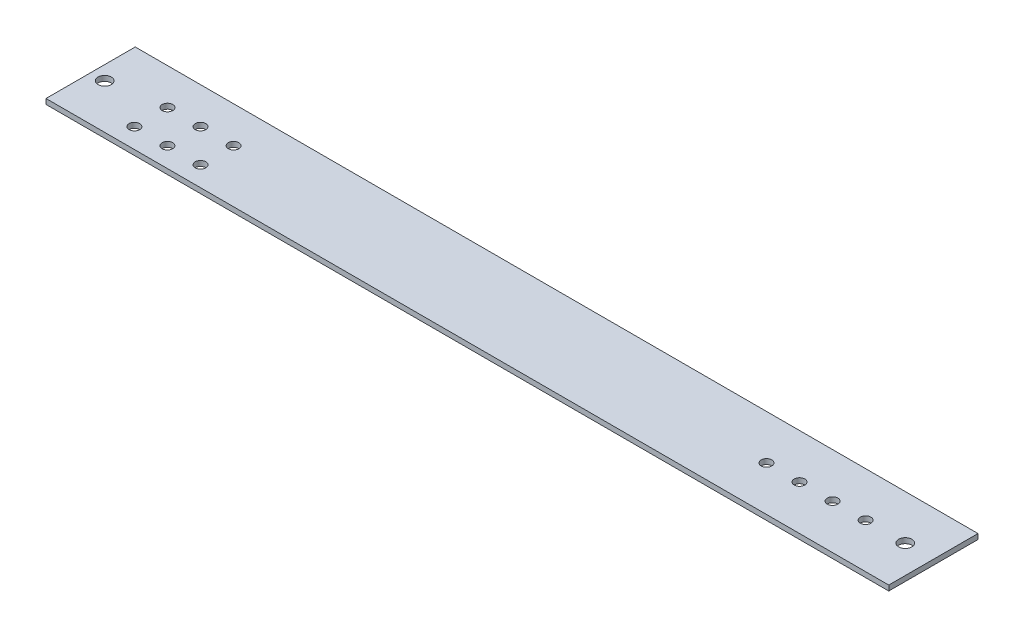
ISO-10303-21;
HEADER;
FILE_DESCRIPTION(('STEP AP214'),'2;1');
FILE_NAME('part.step','',(''),(''),'','','');
FILE_SCHEMA(('AUTOMOTIVE_DESIGN { 1 0 10303 214 1 1 1 1 }'));
ENDSEC;
DATA;
#1=APPLICATION_CONTEXT('core data for automotive mechanical design processes');
#2=APPLICATION_PROTOCOL_DEFINITION('international standard','automotive_design',2000,#1);
#3=PRODUCT_CONTEXT('',#1,'mechanical');
#4=PRODUCT('Part','Part','',(#3));
#5=PRODUCT_RELATED_PRODUCT_CATEGORY('part','',(#4));
#6=PRODUCT_DEFINITION_FORMATION('','',#4);
#7=PRODUCT_DEFINITION_CONTEXT('part definition',#1,'design');
#8=PRODUCT_DEFINITION('design','',#6,#7);
#9=PRODUCT_DEFINITION_SHAPE('','',#8);
#10=(LENGTH_UNIT() NAMED_UNIT(*) SI_UNIT(.MILLI.,.METRE.));
#11=(NAMED_UNIT(*) PLANE_ANGLE_UNIT() SI_UNIT($,.RADIAN.));
#12=(NAMED_UNIT(*) SI_UNIT($,.STERADIAN.) SOLID_ANGLE_UNIT());
#13=UNCERTAINTY_MEASURE_WITH_UNIT(LENGTH_MEASURE(1.E-05),#10,'distance_accuracy_value','');
#14=(GEOMETRIC_REPRESENTATION_CONTEXT(3) GLOBAL_UNCERTAINTY_ASSIGNED_CONTEXT((#13)) GLOBAL_UNIT_ASSIGNED_CONTEXT((#10,
#11,#12)) REPRESENTATION_CONTEXT('',''));
#15=CARTESIAN_POINT('',(0.,0.,0.));
#16=DIRECTION('',(0.,0.,1.));
#17=DIRECTION('',(1.,0.,0.));
#18=AXIS2_PLACEMENT_3D('',#15,#16,#17);
#19=CARTESIAN_POINT('',(0.,0.4,-6.858));
#20=DIRECTION('',(1.,0.,0.));
#21=DIRECTION('',(0.,0.,-1.));
#22=AXIS2_PLACEMENT_3D('',#19,#20,#21);
#23=PLANE('',#22);
#24=DIRECTION('',(0.,0.,1.));
#25=VECTOR('',#24,1.);
#26=CARTESIAN_POINT('',(0.,0.,-6.858));
#27=LINE('',#26,#25);
#28=CARTESIAN_POINT('',(0.,0.,-6.858));
#29=VERTEX_POINT('',#28);
#30=CARTESIAN_POINT('',(0.,0.,0.));
#31=VERTEX_POINT('',#30);
#32=EDGE_CURVE('E97',#29,#31,#27,.T.);
#33=ORIENTED_EDGE('',*,*,#32,.T.);
#34=DIRECTION('',(0.,-1.,0.));
#35=VECTOR('',#34,1.);
#36=CARTESIAN_POINT('',(0.,0.4,0.));
#37=LINE('',#36,#35);
#38=CARTESIAN_POINT('',(0.,0.4,0.));
#39=VERTEX_POINT('',#38);
#40=EDGE_CURVE('E11',#39,#31,#37,.T.);
#41=ORIENTED_EDGE('',*,*,#40,.F.);
#42=DIRECTION('',(0.,0.,1.));
#43=VECTOR('',#42,1.);
#44=CARTESIAN_POINT('',(0.,0.4,-6.858));
#45=LINE('',#44,#43);
#46=CARTESIAN_POINT('',(0.,0.4,-6.858));
#47=VERTEX_POINT('',#46);
#48=EDGE_CURVE('E85',#47,#39,#45,.T.);
#49=ORIENTED_EDGE('',*,*,#48,.F.);
#50=DIRECTION('',(0.,-1.,0.));
#51=VECTOR('',#50,1.);
#52=CARTESIAN_POINT('',(0.,0.4,-6.858));
#53=LINE('',#52,#51);
#54=EDGE_CURVE('E93',#47,#29,#53,.T.);
#55=ORIENTED_EDGE('',*,*,#54,.T.);
#56=EDGE_LOOP('',(#33,#41,#49,#55));
#57=FACE_BOUND('',#56,.T.);
#58=ADVANCED_FACE('F34',(#57),#23,.F.);
#59=CARTESIAN_POINT('',(0.,0.4,0.));
#60=DIRECTION('',(0.,0.,-1.));
#61=DIRECTION('',(-1.,0.,0.));
#62=AXIS2_PLACEMENT_3D('',#59,#60,#61);
#63=PLANE('',#62);
#64=DIRECTION('',(1.,0.,0.));
#65=VECTOR('',#64,1.);
#66=CARTESIAN_POINT('',(0.,0.,0.));
#67=LINE('',#66,#65);
#68=CARTESIAN_POINT('',(64.77,0.,0.));
#69=VERTEX_POINT('',#68);
#70=EDGE_CURVE('E89',#31,#69,#67,.T.);
#71=ORIENTED_EDGE('',*,*,#70,.T.);
#72=DIRECTION('',(0.,-1.,0.));
#73=VECTOR('',#72,1.);
#74=CARTESIAN_POINT('',(64.77,0.4,0.));
#75=LINE('',#74,#73);
#76=CARTESIAN_POINT('',(64.77,0.4,0.));
#77=VERTEX_POINT('',#76);
#78=EDGE_CURVE('E42',#77,#69,#75,.T.);
#79=ORIENTED_EDGE('',*,*,#78,.F.);
#80=DIRECTION('',(1.,0.,0.));
#81=VECTOR('',#80,1.);
#82=CARTESIAN_POINT('',(0.,0.4,0.));
#83=LINE('',#82,#81);
#84=EDGE_CURVE('E80',#39,#77,#83,.T.);
#85=ORIENTED_EDGE('',*,*,#84,.F.);
#86=ORIENTED_EDGE('',*,*,#40,.T.);
#87=EDGE_LOOP('',(#71,#79,#85,#86));
#88=FACE_BOUND('',#87,.T.);
#89=ADVANCED_FACE('F88',(#88),#63,.F.);
#90=CARTESIAN_POINT('',(64.77,0.4,-6.858));
#91=DIRECTION('',(-1.,0.,0.));
#92=DIRECTION('',(0.,0.,1.));
#93=AXIS2_PLACEMENT_3D('',#90,#91,#92);
#94=PLANE('',#93);
#95=DIRECTION('',(0.,0.,-1.));
#96=VECTOR('',#95,1.);
#97=CARTESIAN_POINT('',(64.77,0.,-6.858));
#98=LINE('',#97,#96);
#99=CARTESIAN_POINT('',(64.77,0.,-6.858));
#100=VERTEX_POINT('',#99);
#101=EDGE_CURVE('E67',#69,#100,#98,.T.);
#102=ORIENTED_EDGE('',*,*,#101,.T.);
#103=DIRECTION('',(0.,-1.,0.));
#104=VECTOR('',#103,1.);
#105=CARTESIAN_POINT('',(64.77,0.4,-6.858));
#106=LINE('',#105,#104);
#107=CARTESIAN_POINT('',(64.77,0.4,-6.858));
#108=VERTEX_POINT('',#107);
#109=EDGE_CURVE('E90',#108,#100,#106,.T.);
#110=ORIENTED_EDGE('',*,*,#109,.F.);
#111=DIRECTION('',(0.,0.,-1.));
#112=VECTOR('',#111,1.);
#113=CARTESIAN_POINT('',(64.77,0.4,-6.858));
#114=LINE('',#113,#112);
#115=EDGE_CURVE('E83',#77,#108,#114,.T.);
#116=ORIENTED_EDGE('',*,*,#115,.F.);
#117=ORIENTED_EDGE('',*,*,#78,.T.);
#118=EDGE_LOOP('',(#102,#110,#116,#117));
#119=FACE_BOUND('',#118,.T.);
#120=ADVANCED_FACE('F91',(#119),#94,.F.);
#121=CARTESIAN_POINT('',(0.,0.4,-6.858));
#122=DIRECTION('',(0.,0.,1.));
#123=DIRECTION('',(1.,0.,0.));
#124=AXIS2_PLACEMENT_3D('',#121,#122,#123);
#125=PLANE('',#124);
#126=DIRECTION('',(-1.,0.,0.));
#127=VECTOR('',#126,1.);
#128=CARTESIAN_POINT('',(0.,0.,-6.858));
#129=LINE('',#128,#127);
#130=EDGE_CURVE('E73',#100,#29,#129,.T.);
#131=ORIENTED_EDGE('',*,*,#130,.T.);
#132=ORIENTED_EDGE('',*,*,#54,.F.);
#133=DIRECTION('',(-1.,0.,0.));
#134=VECTOR('',#133,1.);
#135=CARTESIAN_POINT('',(0.,0.4,-6.858));
#136=LINE('',#135,#134);
#137=EDGE_CURVE('E50',#108,#47,#136,.T.);
#138=ORIENTED_EDGE('',*,*,#137,.F.);
#139=ORIENTED_EDGE('',*,*,#109,.T.);
#140=EDGE_LOOP('',(#131,#132,#138,#139));
#141=FACE_BOUND('',#140,.T.);
#142=ADVANCED_FACE('F105',(#141),#125,.F.);
#143=CARTESIAN_POINT('',(0.,0.4,0.));
#144=DIRECTION('',(0.,1.,0.));
#145=DIRECTION('',(0.,0.,1.));
#146=AXIS2_PLACEMENT_3D('',#143,#144,#145);
#147=PLANE('',#146);
#148=CARTESIAN_POINT('',(10.3505,0.4,-1.524));
#149=DIRECTION('',(0.,1.,0.));
#150=DIRECTION('',(0.,0.,1.));
#151=AXIS2_PLACEMENT_3D('',#148,#149,#150);
#152=CIRCLE('',#151,0.406399999999999);
#153=CARTESIAN_POINT('',(10.3505,0.4,-1.1176));
#154=VERTEX_POINT('',#153);
#155=EDGE_CURVE('E177',#154,#154,#152,.T.);
#156=ORIENTED_EDGE('',*,*,#155,.F.);
#157=EDGE_LOOP('',(#156));
#158=FACE_BOUND('',#157,.T.);
#159=CARTESIAN_POINT('',(5.27050000000003,0.4,-1.52399999999996));
#160=DIRECTION('',(0.,1.,0.));
#161=DIRECTION('',(0.,0.,1.));
#162=AXIS2_PLACEMENT_3D('',#159,#160,#161);
#163=CIRCLE('',#162,0.406399999999999);
#164=CARTESIAN_POINT('',(5.27050000000003,0.4,-1.11759999999997));
#165=VERTEX_POINT('',#164);
#166=EDGE_CURVE('E171',#165,#165,#163,.T.);
#167=ORIENTED_EDGE('',*,*,#166,.F.);
#168=EDGE_LOOP('',(#167));
#169=FACE_BOUND('',#168,.T.);
#170=CARTESIAN_POINT('',(7.81050000000003,0.4,-1.52399999999998));
#171=DIRECTION('',(0.,1.,0.));
#172=DIRECTION('',(0.,0.,1.));
#173=AXIS2_PLACEMENT_3D('',#170,#171,#172);
#174=CIRCLE('',#173,0.4064);
#175=CARTESIAN_POINT('',(7.81050000000003,0.4,-1.11759999999998));
#176=VERTEX_POINT('',#175);
#177=EDGE_CURVE('E165',#176,#176,#174,.T.);
#178=ORIENTED_EDGE('',*,*,#177,.F.);
#179=EDGE_LOOP('',(#178));
#180=FACE_BOUND('',#179,.T.);
#181=CARTESIAN_POINT('',(5.2705,0.4,-4.06399999999996));
#182=DIRECTION('',(0.,1.,0.));
#183=DIRECTION('',(0.,0.,1.));
#184=AXIS2_PLACEMENT_3D('',#181,#182,#183);
#185=CIRCLE('',#184,0.406399999999999);
#186=CARTESIAN_POINT('',(5.2705,0.4,-3.65759999999997));
#187=VERTEX_POINT('',#186);
#188=EDGE_CURVE('E159',#187,#187,#185,.T.);
#189=ORIENTED_EDGE('',*,*,#188,.F.);
#190=EDGE_LOOP('',(#189));
#191=FACE_BOUND('',#190,.T.);
#192=CARTESIAN_POINT('',(7.8105,0.4,-4.06399999999998));
#193=DIRECTION('',(0.,1.,0.));
#194=DIRECTION('',(0.,0.,1.));
#195=AXIS2_PLACEMENT_3D('',#192,#193,#194);
#196=CIRCLE('',#195,0.406399999999999);
#197=CARTESIAN_POINT('',(7.8105,0.4,-3.65759999999998));
#198=VERTEX_POINT('',#197);
#199=EDGE_CURVE('E153',#198,#198,#196,.T.);
#200=ORIENTED_EDGE('',*,*,#199,.F.);
#201=EDGE_LOOP('',(#200));
#202=FACE_BOUND('',#201,.T.);
#203=CARTESIAN_POINT('',(1.0795,0.4,-3.429));
#204=DIRECTION('',(0.,1.,0.));
#205=DIRECTION('',(0.,0.,1.));
#206=AXIS2_PLACEMENT_3D('',#203,#204,#205);
#207=CIRCLE('',#206,0.507999999999999);
#208=CARTESIAN_POINT('',(1.0795,0.4,-2.921));
#209=VERTEX_POINT('',#208);
#210=EDGE_CURVE('E147',#209,#209,#207,.T.);
#211=ORIENTED_EDGE('',*,*,#210,.F.);
#212=EDGE_LOOP('',(#211));
#213=FACE_BOUND('',#212,.T.);
#214=CARTESIAN_POINT('',(10.3505,0.4,-4.064));
#215=DIRECTION('',(0.,1.,0.));
#216=DIRECTION('',(0.,0.,1.));
#217=AXIS2_PLACEMENT_3D('',#214,#215,#216);
#218=CIRCLE('',#217,0.406399999999999);
#219=CARTESIAN_POINT('',(10.3505,0.4,-3.6576));
#220=VERTEX_POINT('',#219);
#221=EDGE_CURVE('E141',#220,#220,#218,.T.);
#222=ORIENTED_EDGE('',*,*,#221,.F.);
#223=EDGE_LOOP('',(#222));
#224=FACE_BOUND('',#223,.T.);
#225=CARTESIAN_POINT('',(62.611,0.4,-3.429));
#226=DIRECTION('',(0.,1.,0.));
#227=DIRECTION('',(0.,0.,1.));
#228=AXIS2_PLACEMENT_3D('',#225,#226,#227);
#229=CIRCLE('',#228,0.507999999999988);
#230=CARTESIAN_POINT('',(62.611,0.4,-2.92100000000001));
#231=VERTEX_POINT('',#230);
#232=EDGE_CURVE('E135',#231,#231,#229,.T.);
#233=ORIENTED_EDGE('',*,*,#232,.F.);
#234=EDGE_LOOP('',(#233));
#235=FACE_BOUND('',#234,.T.);
#236=CARTESIAN_POINT('',(59.563,0.4,-3.429));
#237=DIRECTION('',(0.,1.,0.));
#238=DIRECTION('',(0.,0.,1.));
#239=AXIS2_PLACEMENT_3D('',#236,#237,#238);
#240=CIRCLE('',#239,0.406400000000004);
#241=CARTESIAN_POINT('',(59.563,0.4,-3.0226));
#242=VERTEX_POINT('',#241);
#243=EDGE_CURVE('E129',#242,#242,#240,.T.);
#244=ORIENTED_EDGE('',*,*,#243,.F.);
#245=EDGE_LOOP('',(#244));
#246=FACE_BOUND('',#245,.T.);
#247=CARTESIAN_POINT('',(57.023,0.4,-3.429));
#248=DIRECTION('',(0.,1.,0.));
#249=DIRECTION('',(0.,0.,1.));
#250=AXIS2_PLACEMENT_3D('',#247,#248,#249);
#251=CIRCLE('',#250,0.406400000000004);
#252=CARTESIAN_POINT('',(57.023,0.4,-3.0226));
#253=VERTEX_POINT('',#252);
#254=EDGE_CURVE('E123',#253,#253,#251,.T.);
#255=ORIENTED_EDGE('',*,*,#254,.F.);
#256=EDGE_LOOP('',(#255));
#257=FACE_BOUND('',#256,.T.);
#258=CARTESIAN_POINT('',(54.483,0.4,-3.429));
#259=DIRECTION('',(0.,1.,0.));
#260=DIRECTION('',(0.,0.,1.));
#261=AXIS2_PLACEMENT_3D('',#258,#259,#260);
#262=CIRCLE('',#261,0.406400000000004);
#263=CARTESIAN_POINT('',(54.483,0.4,-3.0226));
#264=VERTEX_POINT('',#263);
#265=EDGE_CURVE('E117',#264,#264,#262,.T.);
#266=ORIENTED_EDGE('',*,*,#265,.F.);
#267=EDGE_LOOP('',(#266));
#268=FACE_BOUND('',#267,.T.);
#269=CARTESIAN_POINT('',(51.943,0.4,-3.429));
#270=DIRECTION('',(0.,1.,0.));
#271=DIRECTION('',(0.,0.,1.));
#272=AXIS2_PLACEMENT_3D('',#269,#270,#271);
#273=CIRCLE('',#272,0.406400000000004);
#274=CARTESIAN_POINT('',(51.943,0.4,-3.0226));
#275=VERTEX_POINT('',#274);
#276=EDGE_CURVE('E111',#275,#275,#273,.T.);
#277=ORIENTED_EDGE('',*,*,#276,.F.);
#278=EDGE_LOOP('',(#277));
#279=FACE_BOUND('',#278,.T.);
#280=ORIENTED_EDGE('',*,*,#48,.T.);
#281=ORIENTED_EDGE('',*,*,#84,.T.);
#282=ORIENTED_EDGE('',*,*,#115,.T.);
#283=ORIENTED_EDGE('',*,*,#137,.T.);
#284=EDGE_LOOP('',(#280,#281,#282,#283));
#285=FACE_BOUND('',#284,.T.);
#286=ADVANCED_FACE('F81',(#158,#169,#180,#191,#202,#213,#224,#235,#246,#257,#268,#279,#285),
#147,.T.);
#287=CARTESIAN_POINT('',(0.,0.,0.));
#288=DIRECTION('',(0.,1.,0.));
#289=DIRECTION('',(0.,0.,1.));
#290=AXIS2_PLACEMENT_3D('',#287,#288,#289);
#291=PLANE('',#290);
#292=CARTESIAN_POINT('',(10.3505,0.,-1.524));
#293=DIRECTION('',(0.,1.,0.));
#294=DIRECTION('',(0.,0.,1.));
#295=AXIS2_PLACEMENT_3D('',#292,#293,#294);
#296=CIRCLE('',#295,0.406399999999999);
#297=CARTESIAN_POINT('',(10.3505,0.,-1.1176));
#298=VERTEX_POINT('',#297);
#299=EDGE_CURVE('E174',#298,#298,#296,.T.);
#300=ORIENTED_EDGE('',*,*,#299,.T.);
#301=EDGE_LOOP('',(#300));
#302=FACE_BOUND('',#301,.T.);
#303=CARTESIAN_POINT('',(5.27050000000003,0.,-1.52399999999996));
#304=DIRECTION('',(0.,1.,0.));
#305=DIRECTION('',(0.,0.,1.));
#306=AXIS2_PLACEMENT_3D('',#303,#304,#305);
#307=CIRCLE('',#306,0.406399999999999);
#308=CARTESIAN_POINT('',(5.27050000000003,0.,-1.11759999999997));
#309=VERTEX_POINT('',#308);
#310=EDGE_CURVE('E168',#309,#309,#307,.T.);
#311=ORIENTED_EDGE('',*,*,#310,.T.);
#312=EDGE_LOOP('',(#311));
#313=FACE_BOUND('',#312,.T.);
#314=CARTESIAN_POINT('',(7.81050000000003,0.,-1.52399999999998));
#315=DIRECTION('',(0.,1.,0.));
#316=DIRECTION('',(0.,0.,1.));
#317=AXIS2_PLACEMENT_3D('',#314,#315,#316);
#318=CIRCLE('',#317,0.4064);
#319=CARTESIAN_POINT('',(7.81050000000003,0.,-1.11759999999998));
#320=VERTEX_POINT('',#319);
#321=EDGE_CURVE('E162',#320,#320,#318,.T.);
#322=ORIENTED_EDGE('',*,*,#321,.T.);
#323=EDGE_LOOP('',(#322));
#324=FACE_BOUND('',#323,.T.);
#325=CARTESIAN_POINT('',(5.2705,0.,-4.06399999999996));
#326=DIRECTION('',(0.,1.,0.));
#327=DIRECTION('',(0.,0.,1.));
#328=AXIS2_PLACEMENT_3D('',#325,#326,#327);
#329=CIRCLE('',#328,0.406399999999999);
#330=CARTESIAN_POINT('',(5.2705,0.,-3.65759999999997));
#331=VERTEX_POINT('',#330);
#332=EDGE_CURVE('E156',#331,#331,#329,.T.);
#333=ORIENTED_EDGE('',*,*,#332,.T.);
#334=EDGE_LOOP('',(#333));
#335=FACE_BOUND('',#334,.T.);
#336=CARTESIAN_POINT('',(7.8105,0.,-4.06399999999998));
#337=DIRECTION('',(0.,1.,0.));
#338=DIRECTION('',(0.,0.,1.));
#339=AXIS2_PLACEMENT_3D('',#336,#337,#338);
#340=CIRCLE('',#339,0.406399999999999);
#341=CARTESIAN_POINT('',(7.8105,0.,-3.65759999999998));
#342=VERTEX_POINT('',#341);
#343=EDGE_CURVE('E150',#342,#342,#340,.T.);
#344=ORIENTED_EDGE('',*,*,#343,.T.);
#345=EDGE_LOOP('',(#344));
#346=FACE_BOUND('',#345,.T.);
#347=CARTESIAN_POINT('',(1.0795,0.,-3.429));
#348=DIRECTION('',(0.,1.,0.));
#349=DIRECTION('',(0.,0.,1.));
#350=AXIS2_PLACEMENT_3D('',#347,#348,#349);
#351=CIRCLE('',#350,0.507999999999999);
#352=CARTESIAN_POINT('',(1.0795,0.,-2.921));
#353=VERTEX_POINT('',#352);
#354=EDGE_CURVE('E144',#353,#353,#351,.T.);
#355=ORIENTED_EDGE('',*,*,#354,.T.);
#356=EDGE_LOOP('',(#355));
#357=FACE_BOUND('',#356,.T.);
#358=CARTESIAN_POINT('',(10.3505,0.,-4.064));
#359=DIRECTION('',(0.,1.,0.));
#360=DIRECTION('',(0.,0.,1.));
#361=AXIS2_PLACEMENT_3D('',#358,#359,#360);
#362=CIRCLE('',#361,0.406399999999999);
#363=CARTESIAN_POINT('',(10.3505,0.,-3.6576));
#364=VERTEX_POINT('',#363);
#365=EDGE_CURVE('E138',#364,#364,#362,.T.);
#366=ORIENTED_EDGE('',*,*,#365,.T.);
#367=EDGE_LOOP('',(#366));
#368=FACE_BOUND('',#367,.T.);
#369=CARTESIAN_POINT('',(62.611,0.,-3.429));
#370=DIRECTION('',(0.,1.,0.));
#371=DIRECTION('',(0.,0.,1.));
#372=AXIS2_PLACEMENT_3D('',#369,#370,#371);
#373=CIRCLE('',#372,0.507999999999988);
#374=CARTESIAN_POINT('',(62.611,0.,-2.92100000000001));
#375=VERTEX_POINT('',#374);
#376=EDGE_CURVE('E132',#375,#375,#373,.T.);
#377=ORIENTED_EDGE('',*,*,#376,.T.);
#378=EDGE_LOOP('',(#377));
#379=FACE_BOUND('',#378,.T.);
#380=CARTESIAN_POINT('',(59.563,0.,-3.429));
#381=DIRECTION('',(0.,1.,0.));
#382=DIRECTION('',(0.,0.,1.));
#383=AXIS2_PLACEMENT_3D('',#380,#381,#382);
#384=CIRCLE('',#383,0.406400000000004);
#385=CARTESIAN_POINT('',(59.563,0.,-3.0226));
#386=VERTEX_POINT('',#385);
#387=EDGE_CURVE('E126',#386,#386,#384,.T.);
#388=ORIENTED_EDGE('',*,*,#387,.T.);
#389=EDGE_LOOP('',(#388));
#390=FACE_BOUND('',#389,.T.);
#391=CARTESIAN_POINT('',(57.023,0.,-3.429));
#392=DIRECTION('',(0.,1.,0.));
#393=DIRECTION('',(0.,0.,1.));
#394=AXIS2_PLACEMENT_3D('',#391,#392,#393);
#395=CIRCLE('',#394,0.406400000000004);
#396=CARTESIAN_POINT('',(57.023,0.,-3.0226));
#397=VERTEX_POINT('',#396);
#398=EDGE_CURVE('E120',#397,#397,#395,.T.);
#399=ORIENTED_EDGE('',*,*,#398,.T.);
#400=EDGE_LOOP('',(#399));
#401=FACE_BOUND('',#400,.T.);
#402=CARTESIAN_POINT('',(54.483,0.,-3.429));
#403=DIRECTION('',(0.,1.,0.));
#404=DIRECTION('',(0.,0.,1.));
#405=AXIS2_PLACEMENT_3D('',#402,#403,#404);
#406=CIRCLE('',#405,0.406400000000004);
#407=CARTESIAN_POINT('',(54.483,0.,-3.0226));
#408=VERTEX_POINT('',#407);
#409=EDGE_CURVE('E114',#408,#408,#406,.T.);
#410=ORIENTED_EDGE('',*,*,#409,.T.);
#411=EDGE_LOOP('',(#410));
#412=FACE_BOUND('',#411,.T.);
#413=CARTESIAN_POINT('',(51.943,0.,-3.429));
#414=DIRECTION('',(0.,1.,0.));
#415=DIRECTION('',(0.,0.,1.));
#416=AXIS2_PLACEMENT_3D('',#413,#414,#415);
#417=CIRCLE('',#416,0.406400000000004);
#418=CARTESIAN_POINT('',(51.943,0.,-3.0226));
#419=VERTEX_POINT('',#418);
#420=EDGE_CURVE('E100',#419,#419,#417,.T.);
#421=ORIENTED_EDGE('',*,*,#420,.T.);
#422=EDGE_LOOP('',(#421));
#423=FACE_BOUND('',#422,.T.);
#424=ORIENTED_EDGE('',*,*,#32,.F.);
#425=ORIENTED_EDGE('',*,*,#130,.F.);
#426=ORIENTED_EDGE('',*,*,#101,.F.);
#427=ORIENTED_EDGE('',*,*,#70,.F.);
#428=EDGE_LOOP('',(#424,#425,#426,#427));
#429=FACE_BOUND('',#428,.T.);
#430=ADVANCED_FACE('F108',(#302,#313,#324,#335,#346,#357,#368,#379,#390,#401,#412,#423,#429),
#291,.F.);
#431=CARTESIAN_POINT('',(51.943,0.,-3.429));
#432=DIRECTION('',(0.,1.,0.));
#433=DIRECTION('',(0.,0.,1.));
#434=AXIS2_PLACEMENT_3D('',#431,#432,#433);
#435=CYLINDRICAL_SURFACE('',#434,0.406400000000004);
#436=ORIENTED_EDGE('',*,*,#420,.F.);
#437=EDGE_LOOP('',(#436));
#438=FACE_BOUND('',#437,.T.);
#439=ORIENTED_EDGE('',*,*,#276,.T.);
#440=EDGE_LOOP('',(#439));
#441=FACE_BOUND('',#440,.T.);
#442=ADVANCED_FACE('F217',(#438,#441),#435,.F.);
#443=CARTESIAN_POINT('',(54.483,0.,-3.429));
#444=DIRECTION('',(0.,1.,0.));
#445=DIRECTION('',(0.,0.,1.));
#446=AXIS2_PLACEMENT_3D('',#443,#444,#445);
#447=CYLINDRICAL_SURFACE('',#446,0.406400000000004);
#448=ORIENTED_EDGE('',*,*,#409,.F.);
#449=EDGE_LOOP('',(#448));
#450=FACE_BOUND('',#449,.T.);
#451=ORIENTED_EDGE('',*,*,#265,.T.);
#452=EDGE_LOOP('',(#451));
#453=FACE_BOUND('',#452,.T.);
#454=ADVANCED_FACE('F219',(#450,#453),#447,.F.);
#455=CARTESIAN_POINT('',(57.023,0.,-3.429));
#456=DIRECTION('',(0.,1.,0.));
#457=DIRECTION('',(0.,0.,1.));
#458=AXIS2_PLACEMENT_3D('',#455,#456,#457);
#459=CYLINDRICAL_SURFACE('',#458,0.406400000000004);
#460=ORIENTED_EDGE('',*,*,#398,.F.);
#461=EDGE_LOOP('',(#460));
#462=FACE_BOUND('',#461,.T.);
#463=ORIENTED_EDGE('',*,*,#254,.T.);
#464=EDGE_LOOP('',(#463));
#465=FACE_BOUND('',#464,.T.);
#466=ADVANCED_FACE('F226',(#462,#465),#459,.F.);
#467=CARTESIAN_POINT('',(59.563,0.,-3.429));
#468=DIRECTION('',(0.,1.,0.));
#469=DIRECTION('',(0.,0.,1.));
#470=AXIS2_PLACEMENT_3D('',#467,#468,#469);
#471=CYLINDRICAL_SURFACE('',#470,0.406400000000004);
#472=ORIENTED_EDGE('',*,*,#387,.F.);
#473=EDGE_LOOP('',(#472));
#474=FACE_BOUND('',#473,.T.);
#475=ORIENTED_EDGE('',*,*,#243,.T.);
#476=EDGE_LOOP('',(#475));
#477=FACE_BOUND('',#476,.T.);
#478=ADVANCED_FACE('F272',(#474,#477),#471,.F.);
#479=CARTESIAN_POINT('',(62.611,0.,-3.429));
#480=DIRECTION('',(0.,1.,0.));
#481=DIRECTION('',(0.,0.,1.));
#482=AXIS2_PLACEMENT_3D('',#479,#480,#481);
#483=CYLINDRICAL_SURFACE('',#482,0.507999999999988);
#484=ORIENTED_EDGE('',*,*,#376,.F.);
#485=EDGE_LOOP('',(#484));
#486=FACE_BOUND('',#485,.T.);
#487=ORIENTED_EDGE('',*,*,#232,.T.);
#488=EDGE_LOOP('',(#487));
#489=FACE_BOUND('',#488,.T.);
#490=ADVANCED_FACE('F282',(#486,#489),#483,.F.);
#491=CARTESIAN_POINT('',(10.3505,0.,-4.064));
#492=DIRECTION('',(0.,1.,0.));
#493=DIRECTION('',(0.,0.,1.));
#494=AXIS2_PLACEMENT_3D('',#491,#492,#493);
#495=CYLINDRICAL_SURFACE('',#494,0.406399999999999);
#496=ORIENTED_EDGE('',*,*,#365,.F.);
#497=EDGE_LOOP('',(#496));
#498=FACE_BOUND('',#497,.T.);
#499=ORIENTED_EDGE('',*,*,#221,.T.);
#500=EDGE_LOOP('',(#499));
#501=FACE_BOUND('',#500,.T.);
#502=ADVANCED_FACE('F292',(#498,#501),#495,.F.);
#503=CARTESIAN_POINT('',(1.0795,0.,-3.429));
#504=DIRECTION('',(0.,1.,0.));
#505=DIRECTION('',(0.,0.,1.));
#506=AXIS2_PLACEMENT_3D('',#503,#504,#505);
#507=CYLINDRICAL_SURFACE('',#506,0.507999999999999);
#508=ORIENTED_EDGE('',*,*,#354,.F.);
#509=EDGE_LOOP('',(#508));
#510=FACE_BOUND('',#509,.T.);
#511=ORIENTED_EDGE('',*,*,#210,.T.);
#512=EDGE_LOOP('',(#511));
#513=FACE_BOUND('',#512,.T.);
#514=ADVANCED_FACE('F302',(#510,#513),#507,.F.);
#515=CARTESIAN_POINT('',(7.8105,0.,-4.06399999999998));
#516=DIRECTION('',(0.,1.,0.));
#517=DIRECTION('',(0.,0.,1.));
#518=AXIS2_PLACEMENT_3D('',#515,#516,#517);
#519=CYLINDRICAL_SURFACE('',#518,0.406399999999999);
#520=ORIENTED_EDGE('',*,*,#343,.F.);
#521=EDGE_LOOP('',(#520));
#522=FACE_BOUND('',#521,.T.);
#523=ORIENTED_EDGE('',*,*,#199,.T.);
#524=EDGE_LOOP('',(#523));
#525=FACE_BOUND('',#524,.T.);
#526=ADVANCED_FACE('F312',(#522,#525),#519,.F.);
#527=CARTESIAN_POINT('',(5.2705,0.,-4.06399999999996));
#528=DIRECTION('',(0.,1.,0.));
#529=DIRECTION('',(0.,0.,1.));
#530=AXIS2_PLACEMENT_3D('',#527,#528,#529);
#531=CYLINDRICAL_SURFACE('',#530,0.406399999999999);
#532=ORIENTED_EDGE('',*,*,#332,.F.);
#533=EDGE_LOOP('',(#532));
#534=FACE_BOUND('',#533,.T.);
#535=ORIENTED_EDGE('',*,*,#188,.T.);
#536=EDGE_LOOP('',(#535));
#537=FACE_BOUND('',#536,.T.);
#538=ADVANCED_FACE('F322',(#534,#537),#531,.F.);
#539=CARTESIAN_POINT('',(7.81050000000003,0.,-1.52399999999998));
#540=DIRECTION('',(0.,1.,0.));
#541=DIRECTION('',(0.,0.,1.));
#542=AXIS2_PLACEMENT_3D('',#539,#540,#541);
#543=CYLINDRICAL_SURFACE('',#542,0.4064);
#544=ORIENTED_EDGE('',*,*,#321,.F.);
#545=EDGE_LOOP('',(#544));
#546=FACE_BOUND('',#545,.T.);
#547=ORIENTED_EDGE('',*,*,#177,.T.);
#548=EDGE_LOOP('',(#547));
#549=FACE_BOUND('',#548,.T.);
#550=ADVANCED_FACE('F332',(#546,#549),#543,.F.);
#551=CARTESIAN_POINT('',(5.27050000000003,0.,-1.52399999999996));
#552=DIRECTION('',(0.,1.,0.));
#553=DIRECTION('',(0.,0.,1.));
#554=AXIS2_PLACEMENT_3D('',#551,#552,#553);
#555=CYLINDRICAL_SURFACE('',#554,0.406399999999999);
#556=ORIENTED_EDGE('',*,*,#310,.F.);
#557=EDGE_LOOP('',(#556));
#558=FACE_BOUND('',#557,.T.);
#559=ORIENTED_EDGE('',*,*,#166,.T.);
#560=EDGE_LOOP('',(#559));
#561=FACE_BOUND('',#560,.T.);
#562=ADVANCED_FACE('F188',(#558,#561),#555,.F.);
#563=CARTESIAN_POINT('',(10.3505,0.,-1.524));
#564=DIRECTION('',(0.,1.,0.));
#565=DIRECTION('',(0.,0.,1.));
#566=AXIS2_PLACEMENT_3D('',#563,#564,#565);
#567=CYLINDRICAL_SURFACE('',#566,0.406399999999999);
#568=ORIENTED_EDGE('',*,*,#299,.F.);
#569=EDGE_LOOP('',(#568));
#570=FACE_BOUND('',#569,.T.);
#571=ORIENTED_EDGE('',*,*,#155,.T.);
#572=EDGE_LOOP('',(#571));
#573=FACE_BOUND('',#572,.T.);
#574=ADVANCED_FACE('F185',(#570,#573),#567,.F.);
#575=CLOSED_SHELL('',(#58,#89,#120,#142,#286,#430,#442,#454,#466,#478,#490,#502,#514,#526,#538,
#550,#562,#574));
#576=MANIFOLD_SOLID_BREP('B2',#575);
#577=ADVANCED_BREP_SHAPE_REPRESENTATION('',(#18,#576),#14);
#578=SHAPE_DEFINITION_REPRESENTATION(#9,#577);
ENDSEC;
END-ISO-10303-21;
